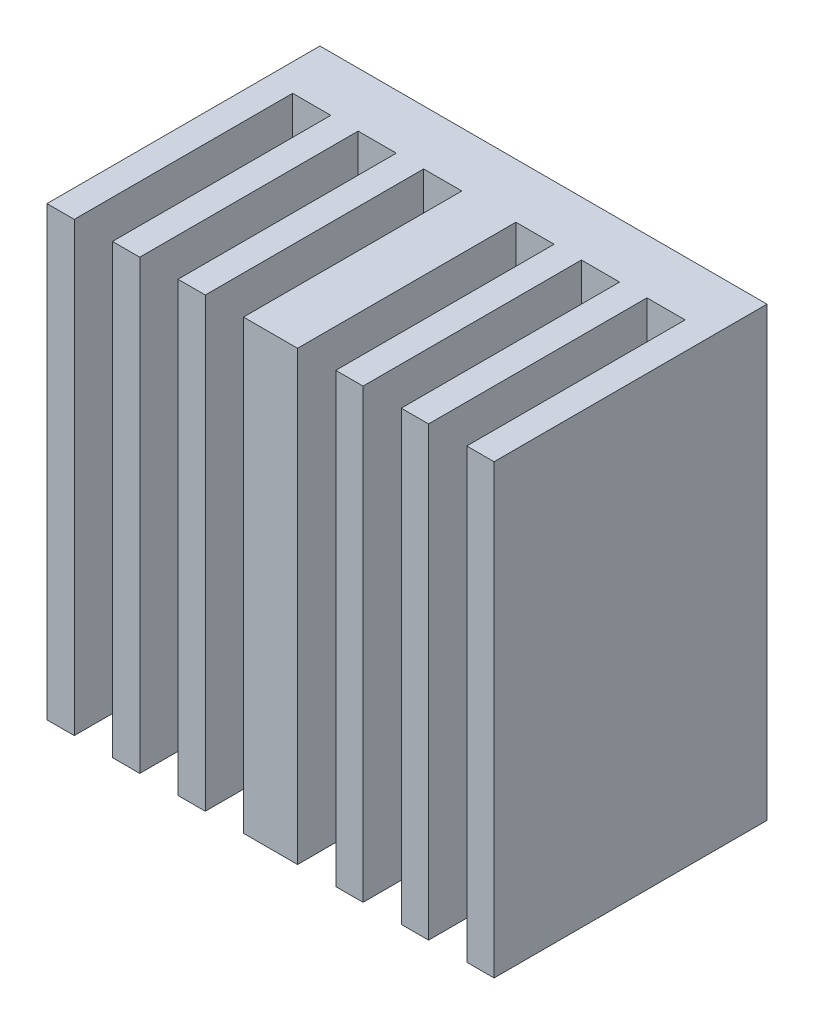
ISO-10303-21;
HEADER;
FILE_DESCRIPTION(('STEP AP214'),'2;1');
FILE_NAME('part.step','',(''),(''),'','','');
FILE_SCHEMA(('AUTOMOTIVE_DESIGN { 1 0 10303 214 1 1 1 1 }'));
ENDSEC;
DATA;
#1=APPLICATION_CONTEXT('core data for automotive mechanical design processes');
#2=APPLICATION_PROTOCOL_DEFINITION('international standard','automotive_design',2000,#1);
#3=PRODUCT_CONTEXT('',#1,'mechanical');
#4=PRODUCT('Part','Part','',(#3));
#5=PRODUCT_RELATED_PRODUCT_CATEGORY('part','',(#4));
#6=PRODUCT_DEFINITION_FORMATION('','',#4);
#7=PRODUCT_DEFINITION_CONTEXT('part definition',#1,'design');
#8=PRODUCT_DEFINITION('design','',#6,#7);
#9=PRODUCT_DEFINITION_SHAPE('','',#8);
#10=(LENGTH_UNIT() NAMED_UNIT(*) SI_UNIT(.MILLI.,.METRE.));
#11=(NAMED_UNIT(*) PLANE_ANGLE_UNIT() SI_UNIT($,.RADIAN.));
#12=(NAMED_UNIT(*) SI_UNIT($,.STERADIAN.) SOLID_ANGLE_UNIT());
#13=UNCERTAINTY_MEASURE_WITH_UNIT(LENGTH_MEASURE(1.E-05),#10,'distance_accuracy_value','');
#14=(GEOMETRIC_REPRESENTATION_CONTEXT(3) GLOBAL_UNCERTAINTY_ASSIGNED_CONTEXT((#13)) GLOBAL_UNIT_ASSIGNED_CONTEXT((#10,
#11,#12)) REPRESENTATION_CONTEXT('',''));
#15=CARTESIAN_POINT('',(0.,0.,0.));
#16=DIRECTION('',(0.,0.,1.));
#17=DIRECTION('',(1.,0.,0.));
#18=AXIS2_PLACEMENT_3D('',#15,#16,#17);
#19=CARTESIAN_POINT('',(0.,0.,5.));
#20=DIRECTION('',(0.,0.,-1.));
#21=DIRECTION('',(-1.,0.,0.));
#22=AXIS2_PLACEMENT_3D('',#19,#20,#21);
#23=PLANE('',#22);
#24=DIRECTION('',(-1.,0.,0.));
#25=VECTOR('',#24,1.);
#26=CARTESIAN_POINT('',(0.,8.19,5.));
#27=LINE('',#26,#25);
#28=CARTESIAN_POINT('',(8.19,8.19,5.));
#29=VERTEX_POINT('',#28);
#30=CARTESIAN_POINT('',(7.69,8.19,5.));
#31=VERTEX_POINT('',#30);
#32=EDGE_CURVE('E389',#29,#31,#27,.T.);
#33=ORIENTED_EDGE('',*,*,#32,.T.);
#34=DIRECTION('',(0.,1.,0.));
#35=VECTOR('',#34,1.);
#36=CARTESIAN_POINT('',(7.69,8.19,5.));
#37=LINE('',#36,#35);
#38=CARTESIAN_POINT('',(7.69,0.,5.));
#39=VERTEX_POINT('',#38);
#40=EDGE_CURVE('E234',#39,#31,#37,.T.);
#41=ORIENTED_EDGE('',*,*,#40,.F.);
#42=DIRECTION('',(1.,0.,0.));
#43=VECTOR('',#42,1.);
#44=CARTESIAN_POINT('',(0.,0.,5.));
#45=LINE('',#44,#43);
#46=CARTESIAN_POINT('',(8.19,0.,5.));
#47=VERTEX_POINT('',#46);
#48=EDGE_CURVE('E380',#39,#47,#45,.T.);
#49=ORIENTED_EDGE('',*,*,#48,.T.);
#50=DIRECTION('',(0.,1.,0.));
#51=VECTOR('',#50,1.);
#52=CARTESIAN_POINT('',(8.19,0.,5.));
#53=LINE('',#52,#51);
#54=EDGE_CURVE('E385',#47,#29,#53,.T.);
#55=ORIENTED_EDGE('',*,*,#54,.T.);
#56=EDGE_LOOP('',(#33,#41,#49,#55));
#57=FACE_BOUND('',#56,.T.);
#58=ADVANCED_FACE('F33',(#57),#23,.F.);
#59=CARTESIAN_POINT('',(6.49,0.,5.));
#60=VERTEX_POINT('',#59);
#61=CARTESIAN_POINT('',(6.99,0.,5.));
#62=VERTEX_POINT('',#61);
#63=EDGE_CURVE('E464',#60,#62,#45,.T.);
#64=ORIENTED_EDGE('',*,*,#63,.T.);
#65=DIRECTION('',(0.,-1.,0.));
#66=VECTOR('',#65,1.);
#67=CARTESIAN_POINT('',(6.99,8.19,5.));
#68=LINE('',#67,#66);
#69=CARTESIAN_POINT('',(6.99,8.19,5.));
#70=VERTEX_POINT('',#69);
#71=EDGE_CURVE('E452',#70,#62,#68,.T.);
#72=ORIENTED_EDGE('',*,*,#71,.F.);
#73=CARTESIAN_POINT('',(6.49,8.19,5.));
#74=VERTEX_POINT('',#73);
#75=EDGE_CURVE('E239',#70,#74,#27,.T.);
#76=ORIENTED_EDGE('',*,*,#75,.T.);
#77=DIRECTION('',(0.,1.,0.));
#78=VECTOR('',#77,1.);
#79=CARTESIAN_POINT('',(6.49,8.19,5.));
#80=LINE('',#79,#78);
#81=EDGE_CURVE('E249',#60,#74,#80,.T.);
#82=ORIENTED_EDGE('',*,*,#81,.F.);
#83=EDGE_LOOP('',(#64,#72,#76,#82));
#84=FACE_BOUND('',#83,.T.);
#85=ADVANCED_FACE('F450',(#84),#23,.F.);
#86=CARTESIAN_POINT('',(5.29,0.,5.));
#87=VERTEX_POINT('',#86);
#88=CARTESIAN_POINT('',(5.79,0.,5.));
#89=VERTEX_POINT('',#88);
#90=EDGE_CURVE('E465',#87,#89,#45,.T.);
#91=ORIENTED_EDGE('',*,*,#90,.T.);
#92=DIRECTION('',(0.,-1.,0.));
#93=VECTOR('',#92,1.);
#94=CARTESIAN_POINT('',(5.79,8.19,5.));
#95=LINE('',#94,#93);
#96=CARTESIAN_POINT('',(5.79,8.19,5.));
#97=VERTEX_POINT('',#96);
#98=EDGE_CURVE('E256',#97,#89,#95,.T.);
#99=ORIENTED_EDGE('',*,*,#98,.F.);
#100=CARTESIAN_POINT('',(5.29,8.19,5.));
#101=VERTEX_POINT('',#100);
#102=EDGE_CURVE('E438',#97,#101,#27,.T.);
#103=ORIENTED_EDGE('',*,*,#102,.T.);
#104=DIRECTION('',(0.,1.,0.));
#105=VECTOR('',#104,1.);
#106=CARTESIAN_POINT('',(5.29,8.19,5.));
#107=LINE('',#106,#105);
#108=EDGE_CURVE('E274',#87,#101,#107,.T.);
#109=ORIENTED_EDGE('',*,*,#108,.F.);
#110=EDGE_LOOP('',(#91,#99,#103,#109));
#111=FACE_BOUND('',#110,.T.);
#112=ADVANCED_FACE('F492',(#111),#23,.F.);
#113=CARTESIAN_POINT('',(2.4,0.,5.));
#114=VERTEX_POINT('',#113);
#115=CARTESIAN_POINT('',(2.9,0.,5.));
#116=VERTEX_POINT('',#115);
#117=EDGE_CURVE('E516',#114,#116,#45,.T.);
#118=ORIENTED_EDGE('',*,*,#117,.T.);
#119=DIRECTION('',(0.,-1.,0.));
#120=VECTOR('',#119,1.);
#121=CARTESIAN_POINT('',(2.9,8.19,5.));
#122=LINE('',#121,#120);
#123=CARTESIAN_POINT('',(2.9,8.19,5.));
#124=VERTEX_POINT('',#123);
#125=EDGE_CURVE('E289',#124,#116,#122,.T.);
#126=ORIENTED_EDGE('',*,*,#125,.F.);
#127=CARTESIAN_POINT('',(2.4,8.19,5.));
#128=VERTEX_POINT('',#127);
#129=EDGE_CURVE('E428',#124,#128,#27,.T.);
#130=ORIENTED_EDGE('',*,*,#129,.T.);
#131=DIRECTION('',(0.,1.,0.));
#132=VECTOR('',#131,1.);
#133=CARTESIAN_POINT('',(2.4,8.19,5.));
#134=LINE('',#133,#132);
#135=EDGE_CURVE('E327',#114,#128,#134,.T.);
#136=ORIENTED_EDGE('',*,*,#135,.F.);
#137=EDGE_LOOP('',(#118,#126,#130,#136));
#138=FACE_BOUND('',#137,.T.);
#139=ADVANCED_FACE('F509',(#138),#23,.F.);
#140=CARTESIAN_POINT('',(1.2,0.,5.));
#141=VERTEX_POINT('',#140);
#142=CARTESIAN_POINT('',(1.7,0.,5.));
#143=VERTEX_POINT('',#142);
#144=EDGE_CURVE('E386',#141,#143,#45,.T.);
#145=ORIENTED_EDGE('',*,*,#144,.T.);
#146=DIRECTION('',(0.,-1.,0.));
#147=VECTOR('',#146,1.);
#148=CARTESIAN_POINT('',(1.7,8.19,5.));
#149=LINE('',#148,#147);
#150=CARTESIAN_POINT('',(1.7,8.19,5.));
#151=VERTEX_POINT('',#150);
#152=EDGE_CURVE('E315',#151,#143,#149,.T.);
#153=ORIENTED_EDGE('',*,*,#152,.F.);
#154=CARTESIAN_POINT('',(1.2,8.19,5.));
#155=VERTEX_POINT('',#154);
#156=EDGE_CURVE('E427',#151,#155,#27,.T.);
#157=ORIENTED_EDGE('',*,*,#156,.T.);
#158=DIRECTION('',(0.,1.,0.));
#159=VECTOR('',#158,1.);
#160=CARTESIAN_POINT('',(1.2,8.19,5.));
#161=LINE('',#160,#159);
#162=EDGE_CURVE('E354',#141,#155,#161,.T.);
#163=ORIENTED_EDGE('',*,*,#162,.F.);
#164=EDGE_LOOP('',(#145,#153,#157,#163));
#165=FACE_BOUND('',#164,.T.);
#166=ADVANCED_FACE('F504',(#165),#23,.F.);
#167=CARTESIAN_POINT('',(0.,0.,5.));
#168=VERTEX_POINT('',#167);
#169=CARTESIAN_POINT('',(0.500000000000001,0.,5.));
#170=VERTEX_POINT('',#169);
#171=EDGE_CURVE('E382',#168,#170,#45,.T.);
#172=ORIENTED_EDGE('',*,*,#171,.T.);
#173=DIRECTION('',(0.,-1.,0.));
#174=VECTOR('',#173,1.);
#175=CARTESIAN_POINT('',(0.5,8.19,5.));
#176=LINE('',#175,#174);
#177=CARTESIAN_POINT('',(0.5,8.19,5.));
#178=VERTEX_POINT('',#177);
#179=EDGE_CURVE('E342',#178,#170,#176,.T.);
#180=ORIENTED_EDGE('',*,*,#179,.F.);
#181=CARTESIAN_POINT('',(0.,8.19,5.));
#182=VERTEX_POINT('',#181);
#183=EDGE_CURVE('E388',#178,#182,#27,.T.);
#184=ORIENTED_EDGE('',*,*,#183,.T.);
#185=DIRECTION('',(0.,-1.,0.));
#186=VECTOR('',#185,1.);
#187=CARTESIAN_POINT('',(0.,0.,5.));
#188=LINE('',#187,#186);
#189=EDGE_CURVE('E377',#182,#168,#188,.T.);
#190=ORIENTED_EDGE('',*,*,#189,.T.);
#191=EDGE_LOOP('',(#172,#180,#184,#190));
#192=FACE_BOUND('',#191,.T.);
#193=ADVANCED_FACE('F424',(#192),#23,.F.);
#194=CARTESIAN_POINT('',(0.,0.,5.));
#195=DIRECTION('',(1.,0.,0.));
#196=DIRECTION('',(0.,0.,-1.));
#197=AXIS2_PLACEMENT_3D('',#194,#195,#196);
#198=PLANE('',#197);
#199=DIRECTION('',(0.,-1.,0.));
#200=VECTOR('',#199,1.);
#201=CARTESIAN_POINT('',(0.,0.,0.));
#202=LINE('',#201,#200);
#203=CARTESIAN_POINT('',(0.,8.19,0.));
#204=VERTEX_POINT('',#203);
#205=CARTESIAN_POINT('',(0.,0.,0.));
#206=VERTEX_POINT('',#205);
#207=EDGE_CURVE('E369',#204,#206,#202,.T.);
#208=ORIENTED_EDGE('',*,*,#207,.T.);
#209=DIRECTION('',(0.,0.,-1.));
#210=VECTOR('',#209,1.);
#211=CARTESIAN_POINT('',(0.,0.,5.));
#212=LINE('',#211,#210);
#213=EDGE_CURVE('E11',#168,#206,#212,.T.);
#214=ORIENTED_EDGE('',*,*,#213,.F.);
#215=ORIENTED_EDGE('',*,*,#189,.F.);
#216=DIRECTION('',(0.,0.,-1.));
#217=VECTOR('',#216,1.);
#218=CARTESIAN_POINT('',(0.,8.19,5.));
#219=LINE('',#218,#217);
#220=EDGE_CURVE('E392',#182,#204,#219,.T.);
#221=ORIENTED_EDGE('',*,*,#220,.T.);
#222=EDGE_LOOP('',(#208,#214,#215,#221));
#223=FACE_BOUND('',#222,.T.);
#224=ADVANCED_FACE('F35',(#223),#198,.F.);
#225=CARTESIAN_POINT('',(0.,0.,5.));
#226=DIRECTION('',(0.,1.,0.));
#227=DIRECTION('',(0.,0.,1.));
#228=AXIS2_PLACEMENT_3D('',#225,#226,#227);
#229=PLANE('',#228);
#230=ORIENTED_EDGE('',*,*,#48,.F.);
#231=DIRECTION('',(0.,0.,1.));
#232=VECTOR('',#231,1.);
#233=CARTESIAN_POINT('',(7.69,0.,1.));
#234=LINE('',#233,#232);
#235=CARTESIAN_POINT('',(7.69,0.,1.));
#236=VERTEX_POINT('',#235);
#237=EDGE_CURVE('E241',#236,#39,#234,.T.);
#238=ORIENTED_EDGE('',*,*,#237,.F.);
#239=DIRECTION('',(1.,0.,0.));
#240=VECTOR('',#239,1.);
#241=CARTESIAN_POINT('',(7.69,0.,1.));
#242=LINE('',#241,#240);
#243=CARTESIAN_POINT('',(6.99,0.,1.));
#244=VERTEX_POINT('',#243);
#245=EDGE_CURVE('E227',#244,#236,#242,.T.);
#246=ORIENTED_EDGE('',*,*,#245,.F.);
#247=DIRECTION('',(0.,0.,1.));
#248=VECTOR('',#247,1.);
#249=CARTESIAN_POINT('',(6.99,0.,1.));
#250=LINE('',#249,#248);
#251=EDGE_CURVE('E225',#244,#62,#250,.T.);
#252=ORIENTED_EDGE('',*,*,#251,.T.);
#253=ORIENTED_EDGE('',*,*,#63,.F.);
#254=DIRECTION('',(0.,0.,1.));
#255=VECTOR('',#254,1.);
#256=CARTESIAN_POINT('',(6.49,0.,1.));
#257=LINE('',#256,#255);
#258=CARTESIAN_POINT('',(6.49,0.,1.));
#259=VERTEX_POINT('',#258);
#260=EDGE_CURVE('E264',#259,#60,#257,.T.);
#261=ORIENTED_EDGE('',*,*,#260,.F.);
#262=DIRECTION('',(1.,0.,0.));
#263=VECTOR('',#262,1.);
#264=CARTESIAN_POINT('',(6.49,0.,1.));
#265=LINE('',#264,#263);
#266=CARTESIAN_POINT('',(5.79,0.,1.));
#267=VERTEX_POINT('',#266);
#268=EDGE_CURVE('E252',#267,#259,#265,.T.);
#269=ORIENTED_EDGE('',*,*,#268,.F.);
#270=DIRECTION('',(0.,0.,1.));
#271=VECTOR('',#270,1.);
#272=CARTESIAN_POINT('',(5.79,0.,1.));
#273=LINE('',#272,#271);
#274=EDGE_CURVE('E266',#267,#89,#273,.T.);
#275=ORIENTED_EDGE('',*,*,#274,.T.);
#276=ORIENTED_EDGE('',*,*,#90,.F.);
#277=DIRECTION('',(0.,0.,1.));
#278=VECTOR('',#277,1.);
#279=CARTESIAN_POINT('',(5.29,0.,1.));
#280=LINE('',#279,#278);
#281=CARTESIAN_POINT('',(5.29,0.,1.));
#282=VERTEX_POINT('',#281);
#283=EDGE_CURVE('E290',#282,#87,#280,.T.);
#284=ORIENTED_EDGE('',*,*,#283,.F.);
#285=DIRECTION('',(1.,0.,0.));
#286=VECTOR('',#285,1.);
#287=CARTESIAN_POINT('',(5.29,0.,1.));
#288=LINE('',#287,#286);
#289=CARTESIAN_POINT('',(4.59,0.,1.));
#290=VERTEX_POINT('',#289);
#291=EDGE_CURVE('E277',#290,#282,#288,.T.);
#292=ORIENTED_EDGE('',*,*,#291,.F.);
#293=DIRECTION('',(0.,0.,1.));
#294=VECTOR('',#293,1.);
#295=CARTESIAN_POINT('',(4.59,0.,1.));
#296=LINE('',#295,#294);
#297=CARTESIAN_POINT('',(4.59,0.,5.));
#298=VERTEX_POINT('',#297);
#299=EDGE_CURVE('E292',#290,#298,#296,.T.);
#300=ORIENTED_EDGE('',*,*,#299,.T.);
#301=CARTESIAN_POINT('',(3.6,0.,5.));
#302=VERTEX_POINT('',#301);
#303=EDGE_CURVE('E466',#302,#298,#45,.T.);
#304=ORIENTED_EDGE('',*,*,#303,.F.);
#305=DIRECTION('',(0.,0.,1.));
#306=VECTOR('',#305,1.);
#307=CARTESIAN_POINT('',(3.6,0.,1.));
#308=LINE('',#307,#306);
#309=CARTESIAN_POINT('',(3.6,0.,1.));
#310=VERTEX_POINT('',#309);
#311=EDGE_CURVE('E319',#310,#302,#308,.T.);
#312=ORIENTED_EDGE('',*,*,#311,.F.);
#313=DIRECTION('',(1.,0.,0.));
#314=VECTOR('',#313,1.);
#315=CARTESIAN_POINT('',(2.9,0.,1.));
#316=LINE('',#315,#314);
#317=CARTESIAN_POINT('',(2.9,0.,1.));
#318=VERTEX_POINT('',#317);
#319=EDGE_CURVE('E299',#318,#310,#316,.T.);
#320=ORIENTED_EDGE('',*,*,#319,.F.);
#321=DIRECTION('',(0.,0.,1.));
#322=VECTOR('',#321,1.);
#323=CARTESIAN_POINT('',(2.9,0.,1.));
#324=LINE('',#323,#322);
#325=EDGE_CURVE('E309',#318,#116,#324,.T.);
#326=ORIENTED_EDGE('',*,*,#325,.T.);
#327=ORIENTED_EDGE('',*,*,#117,.F.);
#328=DIRECTION('',(0.,0.,1.));
#329=VECTOR('',#328,1.);
#330=CARTESIAN_POINT('',(2.4,0.,1.));
#331=LINE('',#330,#329);
#332=CARTESIAN_POINT('',(2.4,0.,1.));
#333=VERTEX_POINT('',#332);
#334=EDGE_CURVE('E346',#333,#114,#331,.T.);
#335=ORIENTED_EDGE('',*,*,#334,.F.);
#336=DIRECTION('',(1.,0.,0.));
#337=VECTOR('',#336,1.);
#338=CARTESIAN_POINT('',(1.7,0.,1.));
#339=LINE('',#338,#337);
#340=CARTESIAN_POINT('',(1.7,0.,1.));
#341=VERTEX_POINT('',#340);
#342=EDGE_CURVE('E326',#341,#333,#339,.T.);
#343=ORIENTED_EDGE('',*,*,#342,.F.);
#344=DIRECTION('',(0.,0.,1.));
#345=VECTOR('',#344,1.);
#346=CARTESIAN_POINT('',(1.7,0.,1.));
#347=LINE('',#346,#345);
#348=EDGE_CURVE('E336',#341,#143,#347,.T.);
#349=ORIENTED_EDGE('',*,*,#348,.T.);
#350=ORIENTED_EDGE('',*,*,#144,.F.);
#351=DIRECTION('',(0.,0.,1.));
#352=VECTOR('',#351,1.);
#353=CARTESIAN_POINT('',(1.2,0.,1.));
#354=LINE('',#353,#352);
#355=CARTESIAN_POINT('',(1.2,0.,1.));
#356=VERTEX_POINT('',#355);
#357=EDGE_CURVE('E373',#356,#141,#354,.T.);
#358=ORIENTED_EDGE('',*,*,#357,.F.);
#359=DIRECTION('',(1.,0.,0.));
#360=VECTOR('',#359,1.);
#361=CARTESIAN_POINT('',(0.500000000000001,0.,1.));
#362=LINE('',#361,#360);
#363=CARTESIAN_POINT('',(0.500000000000001,0.,1.));
#364=VERTEX_POINT('',#363);
#365=EDGE_CURVE('E353',#364,#356,#362,.T.);
#366=ORIENTED_EDGE('',*,*,#365,.F.);
#367=DIRECTION('',(0.,0.,1.));
#368=VECTOR('',#367,1.);
#369=CARTESIAN_POINT('',(0.500000000000001,0.,1.));
#370=LINE('',#369,#368);
#371=EDGE_CURVE('E363',#364,#170,#370,.T.);
#372=ORIENTED_EDGE('',*,*,#371,.T.);
#373=ORIENTED_EDGE('',*,*,#171,.F.);
#374=ORIENTED_EDGE('',*,*,#213,.T.);
#375=DIRECTION('',(1.,0.,0.));
#376=VECTOR('',#375,1.);
#377=CARTESIAN_POINT('',(0.,0.,0.));
#378=LINE('',#377,#376);
#379=CARTESIAN_POINT('',(8.19,0.,0.));
#380=VERTEX_POINT('',#379);
#381=EDGE_CURVE('E395',#206,#380,#378,.T.);
#382=ORIENTED_EDGE('',*,*,#381,.T.);
#383=DIRECTION('',(0.,0.,-1.));
#384=VECTOR('',#383,1.);
#385=CARTESIAN_POINT('',(8.19,0.,5.));
#386=LINE('',#385,#384);
#387=EDGE_CURVE('E41',#47,#380,#386,.T.);
#388=ORIENTED_EDGE('',*,*,#387,.F.);
#389=EDGE_LOOP('',(#230,#238,#246,#252,#253,#261,#269,#275,#276,#284,#292,#300,#304,#312,#320,
#326,#327,#335,#343,#349,#350,#358,#366,#372,#373,#374,#382,#388));
#390=FACE_BOUND('',#389,.T.);
#391=ADVANCED_FACE('F461',(#390),#229,.F.);
#392=CARTESIAN_POINT('',(8.19,0.,5.));
#393=DIRECTION('',(-1.,0.,0.));
#394=DIRECTION('',(0.,0.,1.));
#395=AXIS2_PLACEMENT_3D('',#392,#393,#394);
#396=PLANE('',#395);
#397=DIRECTION('',(0.,1.,0.));
#398=VECTOR('',#397,1.);
#399=CARTESIAN_POINT('',(8.19,0.,0.));
#400=LINE('',#399,#398);
#401=CARTESIAN_POINT('',(8.19,8.19,0.));
#402=VERTEX_POINT('',#401);
#403=EDGE_CURVE('E397',#380,#402,#400,.T.);
#404=ORIENTED_EDGE('',*,*,#403,.T.);
#405=DIRECTION('',(0.,0.,-1.));
#406=VECTOR('',#405,1.);
#407=CARTESIAN_POINT('',(8.19,8.19,5.));
#408=LINE('',#407,#406);
#409=EDGE_CURVE('E402',#29,#402,#408,.T.);
#410=ORIENTED_EDGE('',*,*,#409,.F.);
#411=ORIENTED_EDGE('',*,*,#54,.F.);
#412=ORIENTED_EDGE('',*,*,#387,.T.);
#413=EDGE_LOOP('',(#404,#410,#411,#412));
#414=FACE_BOUND('',#413,.T.);
#415=ADVANCED_FACE('F409',(#414),#396,.F.);
#416=CARTESIAN_POINT('',(0.,8.19,5.));
#417=DIRECTION('',(0.,-1.,0.));
#418=DIRECTION('',(0.,0.,-1.));
#419=AXIS2_PLACEMENT_3D('',#416,#417,#418);
#420=PLANE('',#419);
#421=DIRECTION('',(-1.,0.,0.));
#422=VECTOR('',#421,1.);
#423=CARTESIAN_POINT('',(7.69,8.19,1.));
#424=LINE('',#423,#422);
#425=CARTESIAN_POINT('',(7.69,8.19,1.));
#426=VERTEX_POINT('',#425);
#427=CARTESIAN_POINT('',(6.99,8.19,1.));
#428=VERTEX_POINT('',#427);
#429=EDGE_CURVE('E228',#426,#428,#424,.T.);
#430=ORIENTED_EDGE('',*,*,#429,.F.);
#431=DIRECTION('',(0.,0.,1.));
#432=VECTOR('',#431,1.);
#433=CARTESIAN_POINT('',(7.69,8.19,1.));
#434=LINE('',#433,#432);
#435=EDGE_CURVE('E258',#426,#31,#434,.T.);
#436=ORIENTED_EDGE('',*,*,#435,.T.);
#437=ORIENTED_EDGE('',*,*,#32,.F.);
#438=ORIENTED_EDGE('',*,*,#409,.T.);
#439=DIRECTION('',(-1.,0.,0.));
#440=VECTOR('',#439,1.);
#441=CARTESIAN_POINT('',(0.,8.19,0.));
#442=LINE('',#441,#440);
#443=EDGE_CURVE('E381',#402,#204,#442,.T.);
#444=ORIENTED_EDGE('',*,*,#443,.T.);
#445=ORIENTED_EDGE('',*,*,#220,.F.);
#446=ORIENTED_EDGE('',*,*,#183,.F.);
#447=DIRECTION('',(0.,0.,1.));
#448=VECTOR('',#447,1.);
#449=CARTESIAN_POINT('',(0.5,8.19,1.));
#450=LINE('',#449,#448);
#451=CARTESIAN_POINT('',(0.5,8.19,1.));
#452=VERTEX_POINT('',#451);
#453=EDGE_CURVE('E367',#452,#178,#450,.T.);
#454=ORIENTED_EDGE('',*,*,#453,.F.);
#455=DIRECTION('',(-1.,0.,0.));
#456=VECTOR('',#455,1.);
#457=CARTESIAN_POINT('',(0.5,8.19,1.));
#458=LINE('',#457,#456);
#459=CARTESIAN_POINT('',(1.2,8.19,1.));
#460=VERTEX_POINT('',#459);
#461=EDGE_CURVE('E360',#460,#452,#458,.T.);
#462=ORIENTED_EDGE('',*,*,#461,.F.);
#463=DIRECTION('',(0.,0.,1.));
#464=VECTOR('',#463,1.);
#465=CARTESIAN_POINT('',(1.2,8.19,1.));
#466=LINE('',#465,#464);
#467=EDGE_CURVE('E370',#460,#155,#466,.T.);
#468=ORIENTED_EDGE('',*,*,#467,.T.);
#469=ORIENTED_EDGE('',*,*,#156,.F.);
#470=DIRECTION('',(0.,0.,1.));
#471=VECTOR('',#470,1.);
#472=CARTESIAN_POINT('',(1.7,8.19,1.));
#473=LINE('',#472,#471);
#474=CARTESIAN_POINT('',(1.7,8.19,1.));
#475=VERTEX_POINT('',#474);
#476=EDGE_CURVE('E340',#475,#151,#473,.T.);
#477=ORIENTED_EDGE('',*,*,#476,.F.);
#478=DIRECTION('',(-1.,0.,0.));
#479=VECTOR('',#478,1.);
#480=CARTESIAN_POINT('',(1.7,8.19,1.));
#481=LINE('',#480,#479);
#482=CARTESIAN_POINT('',(2.4,8.19,1.));
#483=VERTEX_POINT('',#482);
#484=EDGE_CURVE('E333',#483,#475,#481,.T.);
#485=ORIENTED_EDGE('',*,*,#484,.F.);
#486=DIRECTION('',(0.,0.,1.));
#487=VECTOR('',#486,1.);
#488=CARTESIAN_POINT('',(2.4,8.19,1.));
#489=LINE('',#488,#487);
#490=EDGE_CURVE('E343',#483,#128,#489,.T.);
#491=ORIENTED_EDGE('',*,*,#490,.T.);
#492=ORIENTED_EDGE('',*,*,#129,.F.);
#493=DIRECTION('',(0.,0.,1.));
#494=VECTOR('',#493,1.);
#495=CARTESIAN_POINT('',(2.9,8.19,1.));
#496=LINE('',#495,#494);
#497=CARTESIAN_POINT('',(2.9,8.19,1.));
#498=VERTEX_POINT('',#497);
#499=EDGE_CURVE('E313',#498,#124,#496,.T.);
#500=ORIENTED_EDGE('',*,*,#499,.F.);
#501=DIRECTION('',(-1.,0.,0.));
#502=VECTOR('',#501,1.);
#503=CARTESIAN_POINT('',(2.9,8.19,1.));
#504=LINE('',#503,#502);
#505=CARTESIAN_POINT('',(3.6,8.19,1.));
#506=VERTEX_POINT('',#505);
#507=EDGE_CURVE('E306',#506,#498,#504,.T.);
#508=ORIENTED_EDGE('',*,*,#507,.F.);
#509=DIRECTION('',(0.,0.,1.));
#510=VECTOR('',#509,1.);
#511=CARTESIAN_POINT('',(3.6,8.19,1.));
#512=LINE('',#511,#510);
#513=CARTESIAN_POINT('',(3.6,8.19,5.));
#514=VERTEX_POINT('',#513);
#515=EDGE_CURVE('E316',#506,#514,#512,.T.);
#516=ORIENTED_EDGE('',*,*,#515,.T.);
#517=CARTESIAN_POINT('',(4.59,8.19,5.));
#518=VERTEX_POINT('',#517);
#519=EDGE_CURVE('E433',#518,#514,#27,.T.);
#520=ORIENTED_EDGE('',*,*,#519,.F.);
#521=DIRECTION('',(0.,0.,1.));
#522=VECTOR('',#521,1.);
#523=CARTESIAN_POINT('',(4.59,8.19,1.));
#524=LINE('',#523,#522);
#525=CARTESIAN_POINT('',(4.59,8.19,1.));
#526=VERTEX_POINT('',#525);
#527=EDGE_CURVE('E282',#526,#518,#524,.T.);
#528=ORIENTED_EDGE('',*,*,#527,.F.);
#529=DIRECTION('',(-1.,0.,0.));
#530=VECTOR('',#529,1.);
#531=CARTESIAN_POINT('',(5.29,8.19,1.));
#532=LINE('',#531,#530);
#533=CARTESIAN_POINT('',(5.29,8.19,1.));
#534=VERTEX_POINT('',#533);
#535=EDGE_CURVE('E270',#534,#526,#532,.T.);
#536=ORIENTED_EDGE('',*,*,#535,.F.);
#537=DIRECTION('',(0.,0.,1.));
#538=VECTOR('',#537,1.);
#539=CARTESIAN_POINT('',(5.29,8.19,1.));
#540=LINE('',#539,#538);
#541=EDGE_CURVE('E286',#534,#101,#540,.T.);
#542=ORIENTED_EDGE('',*,*,#541,.T.);
#543=ORIENTED_EDGE('',*,*,#102,.F.);
#544=DIRECTION('',(0.,0.,1.));
#545=VECTOR('',#544,1.);
#546=CARTESIAN_POINT('',(5.79,8.19,1.));
#547=LINE('',#546,#545);
#548=CARTESIAN_POINT('',(5.79,8.19,1.));
#549=VERTEX_POINT('',#548);
#550=EDGE_CURVE('E255',#549,#97,#547,.T.);
#551=ORIENTED_EDGE('',*,*,#550,.F.);
#552=DIRECTION('',(-1.,0.,0.));
#553=VECTOR('',#552,1.);
#554=CARTESIAN_POINT('',(6.49,8.19,1.));
#555=LINE('',#554,#553);
#556=CARTESIAN_POINT('',(6.49,8.19,1.));
#557=VERTEX_POINT('',#556);
#558=EDGE_CURVE('E246',#557,#549,#555,.T.);
#559=ORIENTED_EDGE('',*,*,#558,.F.);
#560=DIRECTION('',(0.,0.,1.));
#561=VECTOR('',#560,1.);
#562=CARTESIAN_POINT('',(6.49,8.19,1.));
#563=LINE('',#562,#561);
#564=EDGE_CURVE('E261',#557,#74,#563,.T.);
#565=ORIENTED_EDGE('',*,*,#564,.T.);
#566=ORIENTED_EDGE('',*,*,#75,.F.);
#567=DIRECTION('',(0.,0.,1.));
#568=VECTOR('',#567,1.);
#569=CARTESIAN_POINT('',(6.99,8.19,1.));
#570=LINE('',#569,#568);
#571=EDGE_CURVE('E222',#428,#70,#570,.T.);
#572=ORIENTED_EDGE('',*,*,#571,.F.);
#573=EDGE_LOOP('',(#430,#436,#437,#438,#444,#445,#446,#454,#462,#468,#469,#477,#485,#491,#492,
#500,#508,#516,#520,#528,#536,#542,#543,#551,#559,#565,#566,#572));
#574=FACE_BOUND('',#573,.T.);
#575=ADVANCED_FACE('F237',(#574),#420,.F.);
#576=ORIENTED_EDGE('',*,*,#303,.T.);
#577=DIRECTION('',(0.,-1.,0.));
#578=VECTOR('',#577,1.);
#579=CARTESIAN_POINT('',(4.59,8.19,5.));
#580=LINE('',#579,#578);
#581=EDGE_CURVE('E263',#518,#298,#580,.T.);
#582=ORIENTED_EDGE('',*,*,#581,.F.);
#583=ORIENTED_EDGE('',*,*,#519,.T.);
#584=DIRECTION('',(0.,1.,0.));
#585=VECTOR('',#584,1.);
#586=CARTESIAN_POINT('',(3.6,8.19,5.));
#587=LINE('',#586,#585);
#588=EDGE_CURVE('E300',#302,#514,#587,.T.);
#589=ORIENTED_EDGE('',*,*,#588,.F.);
#590=EDGE_LOOP('',(#576,#582,#583,#589));
#591=FACE_BOUND('',#590,.T.);
#592=ADVANCED_FACE('F488',(#591),#23,.F.);
#593=CARTESIAN_POINT('',(0.,0.,0.));
#594=DIRECTION('',(0.,0.,-1.));
#595=DIRECTION('',(-1.,0.,0.));
#596=AXIS2_PLACEMENT_3D('',#593,#594,#595);
#597=PLANE('',#596);
#598=ORIENTED_EDGE('',*,*,#207,.F.);
#599=ORIENTED_EDGE('',*,*,#443,.F.);
#600=ORIENTED_EDGE('',*,*,#403,.F.);
#601=ORIENTED_EDGE('',*,*,#381,.F.);
#602=EDGE_LOOP('',(#598,#599,#600,#601));
#603=FACE_BOUND('',#602,.T.);
#604=ADVANCED_FACE('F416',(#603),#597,.T.);
#605=CARTESIAN_POINT('',(0.5,8.19,1.));
#606=DIRECTION('',(-1.,0.,0.));
#607=DIRECTION('',(0.,-1.,0.));
#608=AXIS2_PLACEMENT_3D('',#605,#606,#607);
#609=PLANE('',#608);
#610=ORIENTED_EDGE('',*,*,#179,.T.);
#611=ORIENTED_EDGE('',*,*,#371,.F.);
#612=DIRECTION('',(0.,-1.,0.));
#613=VECTOR('',#612,1.);
#614=CARTESIAN_POINT('',(0.5,8.19,1.));
#615=LINE('',#614,#613);
#616=EDGE_CURVE('E350',#452,#364,#615,.T.);
#617=ORIENTED_EDGE('',*,*,#616,.F.);
#618=ORIENTED_EDGE('',*,*,#453,.T.);
#619=EDGE_LOOP('',(#610,#611,#617,#618));
#620=FACE_BOUND('',#619,.T.);
#621=ADVANCED_FACE('F500',(#620),#609,.F.);
#622=CARTESIAN_POINT('',(1.2,8.19,1.));
#623=DIRECTION('',(1.,0.,0.));
#624=DIRECTION('',(0.,1.,0.));
#625=AXIS2_PLACEMENT_3D('',#622,#623,#624);
#626=PLANE('',#625);
#627=ORIENTED_EDGE('',*,*,#162,.T.);
#628=ORIENTED_EDGE('',*,*,#467,.F.);
#629=DIRECTION('',(0.,1.,0.));
#630=VECTOR('',#629,1.);
#631=CARTESIAN_POINT('',(1.2,8.19,1.));
#632=LINE('',#631,#630);
#633=EDGE_CURVE('E357',#356,#460,#632,.T.);
#634=ORIENTED_EDGE('',*,*,#633,.F.);
#635=ORIENTED_EDGE('',*,*,#357,.T.);
#636=EDGE_LOOP('',(#627,#628,#634,#635));
#637=FACE_BOUND('',#636,.T.);
#638=ADVANCED_FACE('F551',(#637),#626,.F.);
#639=CARTESIAN_POINT('',(0.,0.,1.));
#640=DIRECTION('',(0.,0.,1.));
#641=DIRECTION('',(1.,0.,0.));
#642=AXIS2_PLACEMENT_3D('',#639,#640,#641);
#643=PLANE('',#642);
#644=ORIENTED_EDGE('',*,*,#616,.T.);
#645=ORIENTED_EDGE('',*,*,#365,.T.);
#646=ORIENTED_EDGE('',*,*,#633,.T.);
#647=ORIENTED_EDGE('',*,*,#461,.T.);
#648=EDGE_LOOP('',(#644,#645,#646,#647));
#649=FACE_BOUND('',#648,.T.);
#650=ADVANCED_FACE('F553',(#649),#643,.T.);
#651=CARTESIAN_POINT('',(1.7,8.19,1.));
#652=DIRECTION('',(-1.,0.,0.));
#653=DIRECTION('',(0.,-1.,0.));
#654=AXIS2_PLACEMENT_3D('',#651,#652,#653);
#655=PLANE('',#654);
#656=ORIENTED_EDGE('',*,*,#152,.T.);
#657=ORIENTED_EDGE('',*,*,#348,.F.);
#658=DIRECTION('',(0.,-1.,0.));
#659=VECTOR('',#658,1.);
#660=CARTESIAN_POINT('',(1.7,8.19,1.));
#661=LINE('',#660,#659);
#662=EDGE_CURVE('E323',#475,#341,#661,.T.);
#663=ORIENTED_EDGE('',*,*,#662,.F.);
#664=ORIENTED_EDGE('',*,*,#476,.T.);
#665=EDGE_LOOP('',(#656,#657,#663,#664));
#666=FACE_BOUND('',#665,.T.);
#667=ADVANCED_FACE('F548',(#666),#655,.F.);
#668=CARTESIAN_POINT('',(2.4,8.19,1.));
#669=DIRECTION('',(1.,0.,0.));
#670=DIRECTION('',(0.,1.,0.));
#671=AXIS2_PLACEMENT_3D('',#668,#669,#670);
#672=PLANE('',#671);
#673=ORIENTED_EDGE('',*,*,#135,.T.);
#674=ORIENTED_EDGE('',*,*,#490,.F.);
#675=DIRECTION('',(0.,1.,0.));
#676=VECTOR('',#675,1.);
#677=CARTESIAN_POINT('',(2.4,8.19,1.));
#678=LINE('',#677,#676);
#679=EDGE_CURVE('E330',#333,#483,#678,.T.);
#680=ORIENTED_EDGE('',*,*,#679,.F.);
#681=ORIENTED_EDGE('',*,*,#334,.T.);
#682=EDGE_LOOP('',(#673,#674,#680,#681));
#683=FACE_BOUND('',#682,.T.);
#684=ADVANCED_FACE('F543',(#683),#672,.F.);
#685=CARTESIAN_POINT('',(0.,0.,1.));
#686=DIRECTION('',(0.,0.,1.));
#687=DIRECTION('',(1.,0.,0.));
#688=AXIS2_PLACEMENT_3D('',#685,#686,#687);
#689=PLANE('',#688);
#690=ORIENTED_EDGE('',*,*,#662,.T.);
#691=ORIENTED_EDGE('',*,*,#342,.T.);
#692=ORIENTED_EDGE('',*,*,#679,.T.);
#693=ORIENTED_EDGE('',*,*,#484,.T.);
#694=EDGE_LOOP('',(#690,#691,#692,#693));
#695=FACE_BOUND('',#694,.T.);
#696=ADVANCED_FACE('F545',(#695),#689,.T.);
#697=CARTESIAN_POINT('',(2.9,8.19,1.));
#698=DIRECTION('',(-1.,0.,0.));
#699=DIRECTION('',(0.,-1.,0.));
#700=AXIS2_PLACEMENT_3D('',#697,#698,#699);
#701=PLANE('',#700);
#702=ORIENTED_EDGE('',*,*,#125,.T.);
#703=ORIENTED_EDGE('',*,*,#325,.F.);
#704=DIRECTION('',(0.,-1.,0.));
#705=VECTOR('',#704,1.);
#706=CARTESIAN_POINT('',(2.9,8.19,1.));
#707=LINE('',#706,#705);
#708=EDGE_CURVE('E296',#498,#318,#707,.T.);
#709=ORIENTED_EDGE('',*,*,#708,.F.);
#710=ORIENTED_EDGE('',*,*,#499,.T.);
#711=EDGE_LOOP('',(#702,#703,#709,#710));
#712=FACE_BOUND('',#711,.T.);
#713=ADVANCED_FACE('F539',(#712),#701,.F.);
#714=CARTESIAN_POINT('',(3.6,8.19,1.));
#715=DIRECTION('',(1.,0.,0.));
#716=DIRECTION('',(0.,1.,0.));
#717=AXIS2_PLACEMENT_3D('',#714,#715,#716);
#718=PLANE('',#717);
#719=ORIENTED_EDGE('',*,*,#588,.T.);
#720=ORIENTED_EDGE('',*,*,#515,.F.);
#721=DIRECTION('',(0.,1.,0.));
#722=VECTOR('',#721,1.);
#723=CARTESIAN_POINT('',(3.6,8.19,1.));
#724=LINE('',#723,#722);
#725=EDGE_CURVE('E303',#310,#506,#724,.T.);
#726=ORIENTED_EDGE('',*,*,#725,.F.);
#727=ORIENTED_EDGE('',*,*,#311,.T.);
#728=EDGE_LOOP('',(#719,#720,#726,#727));
#729=FACE_BOUND('',#728,.T.);
#730=ADVANCED_FACE('F534',(#729),#718,.F.);
#731=CARTESIAN_POINT('',(0.,0.,1.));
#732=DIRECTION('',(0.,0.,1.));
#733=DIRECTION('',(1.,0.,0.));
#734=AXIS2_PLACEMENT_3D('',#731,#732,#733);
#735=PLANE('',#734);
#736=ORIENTED_EDGE('',*,*,#708,.T.);
#737=ORIENTED_EDGE('',*,*,#319,.T.);
#738=ORIENTED_EDGE('',*,*,#725,.T.);
#739=ORIENTED_EDGE('',*,*,#507,.T.);
#740=EDGE_LOOP('',(#736,#737,#738,#739));
#741=FACE_BOUND('',#740,.T.);
#742=ADVANCED_FACE('F536',(#741),#735,.T.);
#743=CARTESIAN_POINT('',(5.29,8.19,1.));
#744=DIRECTION('',(1.,0.,0.));
#745=DIRECTION('',(0.,1.,0.));
#746=AXIS2_PLACEMENT_3D('',#743,#744,#745);
#747=PLANE('',#746);
#748=ORIENTED_EDGE('',*,*,#108,.T.);
#749=ORIENTED_EDGE('',*,*,#541,.F.);
#750=DIRECTION('',(0.,1.,0.));
#751=VECTOR('',#750,1.);
#752=CARTESIAN_POINT('',(5.29,8.19,1.));
#753=LINE('',#752,#751);
#754=EDGE_CURVE('E279',#282,#534,#753,.T.);
#755=ORIENTED_EDGE('',*,*,#754,.F.);
#756=ORIENTED_EDGE('',*,*,#283,.T.);
#757=EDGE_LOOP('',(#748,#749,#755,#756));
#758=FACE_BOUND('',#757,.T.);
#759=ADVANCED_FACE('F576',(#758),#747,.F.);
#760=CARTESIAN_POINT('',(4.59,8.19,1.));
#761=DIRECTION('',(-1.,0.,0.));
#762=DIRECTION('',(0.,0.,1.));
#763=AXIS2_PLACEMENT_3D('',#760,#761,#762);
#764=PLANE('',#763);
#765=ORIENTED_EDGE('',*,*,#581,.T.);
#766=ORIENTED_EDGE('',*,*,#299,.F.);
#767=DIRECTION('',(0.,-1.,0.));
#768=VECTOR('',#767,1.);
#769=CARTESIAN_POINT('',(4.59,8.19,1.));
#770=LINE('',#769,#768);
#771=EDGE_CURVE('E273',#526,#290,#770,.T.);
#772=ORIENTED_EDGE('',*,*,#771,.F.);
#773=ORIENTED_EDGE('',*,*,#527,.T.);
#774=EDGE_LOOP('',(#765,#766,#772,#773));
#775=FACE_BOUND('',#774,.T.);
#776=ADVANCED_FACE('F525',(#775),#764,.F.);
#777=CARTESIAN_POINT('',(0.,0.,1.));
#778=DIRECTION('',(0.,0.,1.));
#779=DIRECTION('',(1.,0.,0.));
#780=AXIS2_PLACEMENT_3D('',#777,#778,#779);
#781=PLANE('',#780);
#782=ORIENTED_EDGE('',*,*,#535,.T.);
#783=ORIENTED_EDGE('',*,*,#771,.T.);
#784=ORIENTED_EDGE('',*,*,#291,.T.);
#785=ORIENTED_EDGE('',*,*,#754,.T.);
#786=EDGE_LOOP('',(#782,#783,#784,#785));
#787=FACE_BOUND('',#786,.T.);
#788=ADVANCED_FACE('F527',(#787),#781,.T.);
#789=CARTESIAN_POINT('',(6.49,8.19,1.));
#790=DIRECTION('',(1.,0.,0.));
#791=DIRECTION('',(0.,1.,0.));
#792=AXIS2_PLACEMENT_3D('',#789,#790,#791);
#793=PLANE('',#792);
#794=ORIENTED_EDGE('',*,*,#81,.T.);
#795=ORIENTED_EDGE('',*,*,#564,.F.);
#796=DIRECTION('',(0.,1.,0.));
#797=VECTOR('',#796,1.);
#798=CARTESIAN_POINT('',(6.49,8.19,1.));
#799=LINE('',#798,#797);
#800=EDGE_CURVE('E56',#259,#557,#799,.T.);
#801=ORIENTED_EDGE('',*,*,#800,.F.);
#802=ORIENTED_EDGE('',*,*,#260,.T.);
#803=EDGE_LOOP('',(#794,#795,#801,#802));
#804=FACE_BOUND('',#803,.T.);
#805=ADVANCED_FACE('F454',(#804),#793,.F.);
#806=CARTESIAN_POINT('',(5.79,8.19,1.));
#807=DIRECTION('',(-1.,0.,0.));
#808=DIRECTION('',(0.,-1.,0.));
#809=AXIS2_PLACEMENT_3D('',#806,#807,#808);
#810=PLANE('',#809);
#811=ORIENTED_EDGE('',*,*,#98,.T.);
#812=ORIENTED_EDGE('',*,*,#274,.F.);
#813=DIRECTION('',(0.,-1.,0.));
#814=VECTOR('',#813,1.);
#815=CARTESIAN_POINT('',(5.79,8.19,1.));
#816=LINE('',#815,#814);
#817=EDGE_CURVE('E248',#549,#267,#816,.T.);
#818=ORIENTED_EDGE('',*,*,#817,.F.);
#819=ORIENTED_EDGE('',*,*,#550,.T.);
#820=EDGE_LOOP('',(#811,#812,#818,#819));
#821=FACE_BOUND('',#820,.T.);
#822=ADVANCED_FACE('F483',(#821),#810,.F.);
#823=CARTESIAN_POINT('',(0.,0.,1.));
#824=DIRECTION('',(0.,0.,1.));
#825=DIRECTION('',(1.,0.,0.));
#826=AXIS2_PLACEMENT_3D('',#823,#824,#825);
#827=PLANE('',#826);
#828=ORIENTED_EDGE('',*,*,#558,.T.);
#829=ORIENTED_EDGE('',*,*,#817,.T.);
#830=ORIENTED_EDGE('',*,*,#268,.T.);
#831=ORIENTED_EDGE('',*,*,#800,.T.);
#832=EDGE_LOOP('',(#828,#829,#830,#831));
#833=FACE_BOUND('',#832,.T.);
#834=ADVANCED_FACE('F458',(#833),#827,.T.);
#835=CARTESIAN_POINT('',(7.69,8.19,1.));
#836=DIRECTION('',(1.,0.,0.));
#837=DIRECTION('',(0.,0.,-1.));
#838=AXIS2_PLACEMENT_3D('',#835,#836,#837);
#839=PLANE('',#838);
#840=ORIENTED_EDGE('',*,*,#40,.T.);
#841=ORIENTED_EDGE('',*,*,#435,.F.);
#842=DIRECTION('',(0.,1.,0.));
#843=VECTOR('',#842,1.);
#844=CARTESIAN_POINT('',(7.69,8.19,1.));
#845=LINE('',#844,#843);
#846=EDGE_CURVE('E48',#236,#426,#845,.T.);
#847=ORIENTED_EDGE('',*,*,#846,.F.);
#848=ORIENTED_EDGE('',*,*,#237,.T.);
#849=EDGE_LOOP('',(#840,#841,#847,#848));
#850=FACE_BOUND('',#849,.T.);
#851=ADVANCED_FACE('F475',(#850),#839,.F.);
#852=CARTESIAN_POINT('',(6.99,8.19,1.));
#853=DIRECTION('',(-1.,0.,0.));
#854=DIRECTION('',(0.,-1.,0.));
#855=AXIS2_PLACEMENT_3D('',#852,#853,#854);
#856=PLANE('',#855);
#857=ORIENTED_EDGE('',*,*,#71,.T.);
#858=ORIENTED_EDGE('',*,*,#251,.F.);
#859=DIRECTION('',(0.,-1.,0.));
#860=VECTOR('',#859,1.);
#861=CARTESIAN_POINT('',(6.99,8.19,1.));
#862=LINE('',#861,#860);
#863=EDGE_CURVE('E219',#428,#244,#862,.T.);
#864=ORIENTED_EDGE('',*,*,#863,.F.);
#865=ORIENTED_EDGE('',*,*,#571,.T.);
#866=EDGE_LOOP('',(#857,#858,#864,#865));
#867=FACE_BOUND('',#866,.T.);
#868=ADVANCED_FACE('F220',(#867),#856,.F.);
#869=CARTESIAN_POINT('',(0.,0.,1.));
#870=DIRECTION('',(0.,0.,1.));
#871=DIRECTION('',(1.,0.,0.));
#872=AXIS2_PLACEMENT_3D('',#869,#870,#871);
#873=PLANE('',#872);
#874=ORIENTED_EDGE('',*,*,#429,.T.);
#875=ORIENTED_EDGE('',*,*,#863,.T.);
#876=ORIENTED_EDGE('',*,*,#245,.T.);
#877=ORIENTED_EDGE('',*,*,#846,.T.);
#878=EDGE_LOOP('',(#874,#875,#876,#877));
#879=FACE_BOUND('',#878,.T.);
#880=ADVANCED_FACE('F231',(#879),#873,.T.);
#881=CLOSED_SHELL('',(#58,#85,#112,#139,#166,#193,#224,#391,#415,#575,#592,#604,#621,#638,#650,
#667,#684,#696,#713,#730,#742,#759,#776,#788,#805,#822,#834,#851,#868,#880));
#882=MANIFOLD_SOLID_BREP('B2',#881);
#883=ADVANCED_BREP_SHAPE_REPRESENTATION('',(#18,#882),#14);
#884=SHAPE_DEFINITION_REPRESENTATION(#9,#883);
ENDSEC;
END-ISO-10303-21;
